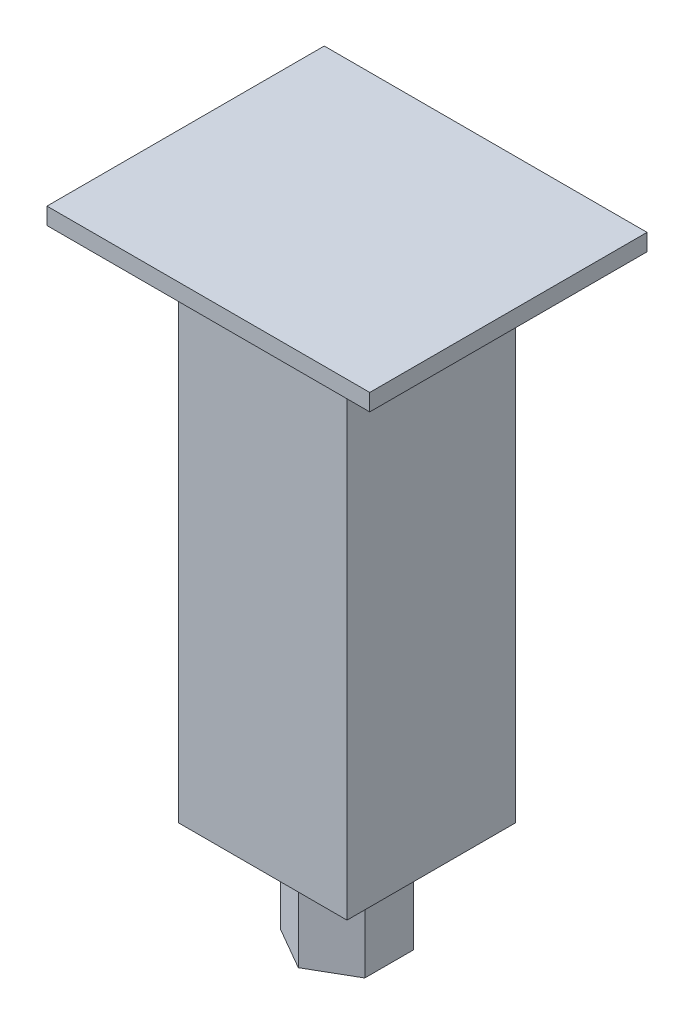
ISO-10303-21;
HEADER;
FILE_DESCRIPTION(('STEP AP214'),'2;1');
FILE_NAME('part.step','',(''),(''),'','','');
FILE_SCHEMA(('AUTOMOTIVE_DESIGN { 1 0 10303 214 1 1 1 1 }'));
ENDSEC;
DATA;
#1=APPLICATION_CONTEXT('core data for automotive mechanical design processes');
#2=APPLICATION_PROTOCOL_DEFINITION('international standard','automotive_design',2000,#1);
#3=PRODUCT_CONTEXT('',#1,'mechanical');
#4=PRODUCT('Part','Part','',(#3));
#5=PRODUCT_RELATED_PRODUCT_CATEGORY('part','',(#4));
#6=PRODUCT_DEFINITION_FORMATION('','',#4);
#7=PRODUCT_DEFINITION_CONTEXT('part definition',#1,'design');
#8=PRODUCT_DEFINITION('design','',#6,#7);
#9=PRODUCT_DEFINITION_SHAPE('','',#8);
#10=(LENGTH_UNIT() NAMED_UNIT(*) SI_UNIT(.MILLI.,.METRE.));
#11=(NAMED_UNIT(*) PLANE_ANGLE_UNIT() SI_UNIT($,.RADIAN.));
#12=(NAMED_UNIT(*) SI_UNIT($,.STERADIAN.) SOLID_ANGLE_UNIT());
#13=UNCERTAINTY_MEASURE_WITH_UNIT(LENGTH_MEASURE(1.E-05),#10,'distance_accuracy_value','');
#14=(GEOMETRIC_REPRESENTATION_CONTEXT(3) GLOBAL_UNCERTAINTY_ASSIGNED_CONTEXT((#13)) GLOBAL_UNIT_ASSIGNED_CONTEXT((#10,
#11,#12)) REPRESENTATION_CONTEXT('',''));
#15=CARTESIAN_POINT('',(0.,0.,0.));
#16=DIRECTION('',(0.,0.,1.));
#17=DIRECTION('',(1.,0.,0.));
#18=AXIS2_PLACEMENT_3D('',#15,#16,#17);
#19=CARTESIAN_POINT('',(5.,12.,-2.88675134594813));
#20=DIRECTION('',(-0.5,0.,0.866025403784439));
#21=DIRECTION('',(0.866025403784439,0.,0.5));
#22=AXIS2_PLACEMENT_3D('',#19,#20,#21);
#23=PLANE('',#22);
#24=DIRECTION('',(-0.866025403784439,0.,-0.5));
#25=VECTOR('',#24,1.);
#26=CARTESIAN_POINT('',(5.,0.,-2.88675134594813));
#27=LINE('',#26,#25);
#28=CARTESIAN_POINT('',(5.,0.,-2.88675134594813));
#29=VERTEX_POINT('',#28);
#30=CARTESIAN_POINT('',(0.,0.,-5.77350269189626));
#31=VERTEX_POINT('',#30);
#32=EDGE_CURVE('E143',#29,#31,#27,.T.);
#33=ORIENTED_EDGE('',*,*,#32,.T.);
#34=DIRECTION('',(0.,-1.,0.));
#35=VECTOR('',#34,1.);
#36=CARTESIAN_POINT('',(0.,12.,-5.77350269189626));
#37=LINE('',#36,#35);
#38=CARTESIAN_POINT('',(0.,12.,-5.77350269189626));
#39=VERTEX_POINT('',#38);
#40=EDGE_CURVE('E11',#39,#31,#37,.T.);
#41=ORIENTED_EDGE('',*,*,#40,.F.);
#42=DIRECTION('',(-0.866025403784439,0.,-0.5));
#43=VECTOR('',#42,1.);
#44=CARTESIAN_POINT('',(5.,12.,-2.88675134594813));
#45=LINE('',#44,#43);
#46=CARTESIAN_POINT('',(5.,12.,-2.88675134594813));
#47=VERTEX_POINT('',#46);
#48=EDGE_CURVE('E133',#47,#39,#45,.T.);
#49=ORIENTED_EDGE('',*,*,#48,.F.);
#50=DIRECTION('',(0.,-1.,0.));
#51=VECTOR('',#50,1.);
#52=CARTESIAN_POINT('',(5.,12.,-2.88675134594813));
#53=LINE('',#52,#51);
#54=EDGE_CURVE('E142',#47,#29,#53,.T.);
#55=ORIENTED_EDGE('',*,*,#54,.T.);
#56=EDGE_LOOP('',(#33,#41,#49,#55));
#57=FACE_BOUND('',#56,.T.);
#58=ADVANCED_FACE('F43',(#57),#23,.F.);
#59=CARTESIAN_POINT('',(0.,12.,-5.77350269189626));
#60=DIRECTION('',(0.5,0.,0.866025403784438));
#61=DIRECTION('',(0.866025403784439,0.,-0.5));
#62=AXIS2_PLACEMENT_3D('',#59,#60,#61);
#63=PLANE('',#62);
#64=DIRECTION('',(-0.866025403784439,0.,0.5));
#65=VECTOR('',#64,1.);
#66=CARTESIAN_POINT('',(0.,0.,-5.77350269189626));
#67=LINE('',#66,#65);
#68=CARTESIAN_POINT('',(-5.,0.,-2.88675134594813));
#69=VERTEX_POINT('',#68);
#70=EDGE_CURVE('E147',#31,#69,#67,.T.);
#71=ORIENTED_EDGE('',*,*,#70,.T.);
#72=DIRECTION('',(0.,-1.,0.));
#73=VECTOR('',#72,1.);
#74=CARTESIAN_POINT('',(-5.,12.,-2.88675134594813));
#75=LINE('',#74,#73);
#76=CARTESIAN_POINT('',(-5.,12.,-2.88675134594813));
#77=VERTEX_POINT('',#76);
#78=EDGE_CURVE('E52',#77,#69,#75,.T.);
#79=ORIENTED_EDGE('',*,*,#78,.F.);
#80=DIRECTION('',(-0.866025403784439,0.,0.5));
#81=VECTOR('',#80,1.);
#82=CARTESIAN_POINT('',(0.,12.,-5.77350269189626));
#83=LINE('',#82,#81);
#84=EDGE_CURVE('E96',#39,#77,#83,.T.);
#85=ORIENTED_EDGE('',*,*,#84,.F.);
#86=ORIENTED_EDGE('',*,*,#40,.T.);
#87=EDGE_LOOP('',(#71,#79,#85,#86));
#88=FACE_BOUND('',#87,.T.);
#89=ADVANCED_FACE('F345',(#88),#63,.F.);
#90=CARTESIAN_POINT('',(-5.,12.,-2.88675134594813));
#91=DIRECTION('',(1.,0.,0.));
#92=DIRECTION('',(0.,0.,-1.));
#93=AXIS2_PLACEMENT_3D('',#90,#91,#92);
#94=PLANE('',#93);
#95=DIRECTION('',(0.,0.,1.));
#96=VECTOR('',#95,1.);
#97=CARTESIAN_POINT('',(-5.,0.,-2.88675134594813));
#98=LINE('',#97,#96);
#99=CARTESIAN_POINT('',(-5.,0.,2.88675134594813));
#100=VERTEX_POINT('',#99);
#101=EDGE_CURVE('E112',#69,#100,#98,.T.);
#102=ORIENTED_EDGE('',*,*,#101,.T.);
#103=DIRECTION('',(0.,-1.,0.));
#104=VECTOR('',#103,1.);
#105=CARTESIAN_POINT('',(-5.,12.,2.88675134594813));
#106=LINE('',#105,#104);
#107=CARTESIAN_POINT('',(-5.,12.,2.88675134594813));
#108=VERTEX_POINT('',#107);
#109=EDGE_CURVE('E105',#108,#100,#106,.T.);
#110=ORIENTED_EDGE('',*,*,#109,.F.);
#111=DIRECTION('',(0.,0.,1.));
#112=VECTOR('',#111,1.);
#113=CARTESIAN_POINT('',(-5.,12.,-2.88675134594813));
#114=LINE('',#113,#112);
#115=EDGE_CURVE('E110',#77,#108,#114,.T.);
#116=ORIENTED_EDGE('',*,*,#115,.F.);
#117=ORIENTED_EDGE('',*,*,#78,.T.);
#118=EDGE_LOOP('',(#102,#110,#116,#117));
#119=FACE_BOUND('',#118,.T.);
#120=ADVANCED_FACE('F107',(#119),#94,.F.);
#121=CARTESIAN_POINT('',(-5.,12.,2.88675134594813));
#122=DIRECTION('',(0.5,0.,-0.866025403784438));
#123=DIRECTION('',(-0.866025403784439,0.,-0.5));
#124=AXIS2_PLACEMENT_3D('',#121,#122,#123);
#125=PLANE('',#124);
#126=DIRECTION('',(0.866025403784439,0.,0.5));
#127=VECTOR('',#126,1.);
#128=CARTESIAN_POINT('',(-5.,0.,2.88675134594813));
#129=LINE('',#128,#127);
#130=CARTESIAN_POINT('',(0.,0.,5.77350269189626));
#131=VERTEX_POINT('',#130);
#132=EDGE_CURVE('E153',#100,#131,#129,.T.);
#133=ORIENTED_EDGE('',*,*,#132,.T.);
#134=DIRECTION('',(0.,-1.,0.));
#135=VECTOR('',#134,1.);
#136=CARTESIAN_POINT('',(0.,12.,5.77350269189626));
#137=LINE('',#136,#135);
#138=CARTESIAN_POINT('',(0.,12.,5.77350269189626));
#139=VERTEX_POINT('',#138);
#140=EDGE_CURVE('E116',#139,#131,#137,.T.);
#141=ORIENTED_EDGE('',*,*,#140,.F.);
#142=DIRECTION('',(0.866025403784439,0.,0.5));
#143=VECTOR('',#142,1.);
#144=CARTESIAN_POINT('',(-5.,12.,2.88675134594813));
#145=LINE('',#144,#143);
#146=EDGE_CURVE('E119',#108,#139,#145,.T.);
#147=ORIENTED_EDGE('',*,*,#146,.F.);
#148=ORIENTED_EDGE('',*,*,#109,.T.);
#149=EDGE_LOOP('',(#133,#141,#147,#148));
#150=FACE_BOUND('',#149,.T.);
#151=ADVANCED_FACE('F120',(#150),#125,.F.);
#152=CARTESIAN_POINT('',(0.,12.,5.77350269189626));
#153=DIRECTION('',(-0.5,0.,-0.866025403784439));
#154=DIRECTION('',(-0.866025403784439,0.,0.5));
#155=AXIS2_PLACEMENT_3D('',#152,#153,#154);
#156=PLANE('',#155);
#157=DIRECTION('',(0.866025403784439,0.,-0.5));
#158=VECTOR('',#157,1.);
#159=CARTESIAN_POINT('',(0.,0.,5.77350269189626));
#160=LINE('',#159,#158);
#161=CARTESIAN_POINT('',(5.,0.,2.88675134594813));
#162=VERTEX_POINT('',#161);
#163=EDGE_CURVE('E82',#131,#162,#160,.T.);
#164=ORIENTED_EDGE('',*,*,#163,.T.);
#165=DIRECTION('',(0.,-1.,0.));
#166=VECTOR('',#165,1.);
#167=CARTESIAN_POINT('',(5.,12.,2.88675134594813));
#168=LINE('',#167,#166);
#169=CARTESIAN_POINT('',(5.,12.,2.88675134594813));
#170=VERTEX_POINT('',#169);
#171=EDGE_CURVE('E60',#170,#162,#168,.T.);
#172=ORIENTED_EDGE('',*,*,#171,.F.);
#173=DIRECTION('',(0.866025403784439,0.,-0.5));
#174=VECTOR('',#173,1.);
#175=CARTESIAN_POINT('',(0.,12.,5.77350269189626));
#176=LINE('',#175,#174);
#177=EDGE_CURVE('E124',#139,#170,#176,.T.);
#178=ORIENTED_EDGE('',*,*,#177,.F.);
#179=ORIENTED_EDGE('',*,*,#140,.T.);
#180=EDGE_LOOP('',(#164,#172,#178,#179));
#181=FACE_BOUND('',#180,.T.);
#182=ADVANCED_FACE('F169',(#181),#156,.F.);
#183=CARTESIAN_POINT('',(5.,12.,2.88675134594813));
#184=DIRECTION('',(-1.,0.,0.));
#185=DIRECTION('',(0.,0.,1.));
#186=AXIS2_PLACEMENT_3D('',#183,#184,#185);
#187=PLANE('',#186);
#188=DIRECTION('',(0.,0.,-1.));
#189=VECTOR('',#188,1.);
#190=CARTESIAN_POINT('',(5.,0.,2.88675134594813));
#191=LINE('',#190,#189);
#192=EDGE_CURVE('E88',#162,#29,#191,.T.);
#193=ORIENTED_EDGE('',*,*,#192,.T.);
#194=ORIENTED_EDGE('',*,*,#54,.F.);
#195=DIRECTION('',(0.,0.,-1.));
#196=VECTOR('',#195,1.);
#197=CARTESIAN_POINT('',(5.,12.,2.88675134594813));
#198=LINE('',#197,#196);
#199=EDGE_CURVE('E139',#170,#47,#198,.T.);
#200=ORIENTED_EDGE('',*,*,#199,.F.);
#201=ORIENTED_EDGE('',*,*,#171,.T.);
#202=EDGE_LOOP('',(#193,#194,#200,#201));
#203=FACE_BOUND('',#202,.T.);
#204=ADVANCED_FACE('F172',(#203),#187,.F.);
#205=CARTESIAN_POINT('',(0.,0.,0.));
#206=DIRECTION('',(0.,1.,0.));
#207=DIRECTION('',(0.,0.,1.));
#208=AXIS2_PLACEMENT_3D('',#205,#206,#207);
#209=PLANE('',#208);
#210=ORIENTED_EDGE('',*,*,#32,.F.);
#211=ORIENTED_EDGE('',*,*,#192,.F.);
#212=ORIENTED_EDGE('',*,*,#163,.F.);
#213=ORIENTED_EDGE('',*,*,#132,.F.);
#214=ORIENTED_EDGE('',*,*,#101,.F.);
#215=ORIENTED_EDGE('',*,*,#70,.F.);
#216=EDGE_LOOP('',(#210,#211,#212,#213,#214,#215));
#217=FACE_BOUND('',#216,.T.);
#218=ADVANCED_FACE('F168',(#217),#209,.F.);
#219=CARTESIAN_POINT('',(10.,72.,10.));
#220=DIRECTION('',(-1.,0.,0.));
#221=DIRECTION('',(0.,0.,1.));
#222=AXIS2_PLACEMENT_3D('',#219,#220,#221);
#223=PLANE('',#222);
#224=DIRECTION('',(0.,0.,-1.));
#225=VECTOR('',#224,1.);
#226=CARTESIAN_POINT('',(10.,12.,10.));
#227=LINE('',#226,#225);
#228=CARTESIAN_POINT('',(10.,12.,10.));
#229=VERTEX_POINT('',#228);
#230=CARTESIAN_POINT('',(10.,12.,-10.));
#231=VERTEX_POINT('',#230);
#232=EDGE_CURVE('E205',#229,#231,#227,.T.);
#233=ORIENTED_EDGE('',*,*,#232,.T.);
#234=DIRECTION('',(0.,-1.,0.));
#235=VECTOR('',#234,1.);
#236=CARTESIAN_POINT('',(10.,72.,-10.));
#237=LINE('',#236,#235);
#238=CARTESIAN_POINT('',(10.,72.,-10.));
#239=VERTEX_POINT('',#238);
#240=EDGE_CURVE('E148',#239,#231,#237,.T.);
#241=ORIENTED_EDGE('',*,*,#240,.F.);
#242=DIRECTION('',(0.,0.,-1.));
#243=VECTOR('',#242,1.);
#244=CARTESIAN_POINT('',(10.,72.,10.));
#245=LINE('',#244,#243);
#246=CARTESIAN_POINT('',(10.,72.,10.));
#247=VERTEX_POINT('',#246);
#248=EDGE_CURVE('E196',#247,#239,#245,.T.);
#249=ORIENTED_EDGE('',*,*,#248,.F.);
#250=DIRECTION('',(0.,-1.,0.));
#251=VECTOR('',#250,1.);
#252=CARTESIAN_POINT('',(10.,72.,10.));
#253=LINE('',#252,#251);
#254=EDGE_CURVE('E187',#247,#229,#253,.T.);
#255=ORIENTED_EDGE('',*,*,#254,.T.);
#256=EDGE_LOOP('',(#233,#241,#249,#255));
#257=FACE_BOUND('',#256,.T.);
#258=ADVANCED_FACE('F327',(#257),#223,.F.);
#259=CARTESIAN_POINT('',(-10.,72.,-10.));
#260=DIRECTION('',(0.,0.,1.));
#261=DIRECTION('',(1.,0.,0.));
#262=AXIS2_PLACEMENT_3D('',#259,#260,#261);
#263=PLANE('',#262);
#264=DIRECTION('',(-1.,0.,0.));
#265=VECTOR('',#264,1.);
#266=CARTESIAN_POINT('',(-10.,12.,-10.));
#267=LINE('',#266,#265);
#268=CARTESIAN_POINT('',(-10.,12.,-10.));
#269=VERTEX_POINT('',#268);
#270=EDGE_CURVE('E201',#231,#269,#267,.T.);
#271=ORIENTED_EDGE('',*,*,#270,.T.);
#272=DIRECTION('',(0.,-1.,0.));
#273=VECTOR('',#272,1.);
#274=CARTESIAN_POINT('',(-10.,72.,-10.));
#275=LINE('',#274,#273);
#276=CARTESIAN_POINT('',(-10.,72.,-10.));
#277=VERTEX_POINT('',#276);
#278=EDGE_CURVE('E179',#277,#269,#275,.T.);
#279=ORIENTED_EDGE('',*,*,#278,.F.);
#280=DIRECTION('',(-1.,0.,0.));
#281=VECTOR('',#280,1.);
#282=CARTESIAN_POINT('',(-10.,72.,-10.));
#283=LINE('',#282,#281);
#284=EDGE_CURVE('E217',#239,#277,#283,.T.);
#285=ORIENTED_EDGE('',*,*,#284,.F.);
#286=ORIENTED_EDGE('',*,*,#240,.T.);
#287=EDGE_LOOP('',(#271,#279,#285,#286));
#288=FACE_BOUND('',#287,.T.);
#289=ADVANCED_FACE('F330',(#288),#263,.F.);
#290=CARTESIAN_POINT('',(-10.,72.,10.));
#291=DIRECTION('',(1.,0.,0.));
#292=DIRECTION('',(0.,0.,-1.));
#293=AXIS2_PLACEMENT_3D('',#290,#291,#292);
#294=PLANE('',#293);
#295=DIRECTION('',(0.,0.,1.));
#296=VECTOR('',#295,1.);
#297=CARTESIAN_POINT('',(-10.,12.,10.));
#298=LINE('',#297,#296);
#299=CARTESIAN_POINT('',(-10.,12.,10.));
#300=VERTEX_POINT('',#299);
#301=EDGE_CURVE('E197',#269,#300,#298,.T.);
#302=ORIENTED_EDGE('',*,*,#301,.T.);
#303=DIRECTION('',(0.,-1.,0.));
#304=VECTOR('',#303,1.);
#305=CARTESIAN_POINT('',(-10.,72.,10.));
#306=LINE('',#305,#304);
#307=CARTESIAN_POINT('',(-10.,72.,10.));
#308=VERTEX_POINT('',#307);
#309=EDGE_CURVE('E183',#308,#300,#306,.T.);
#310=ORIENTED_EDGE('',*,*,#309,.F.);
#311=DIRECTION('',(0.,0.,1.));
#312=VECTOR('',#311,1.);
#313=CARTESIAN_POINT('',(-10.,72.,10.));
#314=LINE('',#313,#312);
#315=EDGE_CURVE('E213',#277,#308,#314,.T.);
#316=ORIENTED_EDGE('',*,*,#315,.F.);
#317=ORIENTED_EDGE('',*,*,#278,.T.);
#318=EDGE_LOOP('',(#302,#310,#316,#317));
#319=FACE_BOUND('',#318,.T.);
#320=ADVANCED_FACE('F335',(#319),#294,.F.);
#321=CARTESIAN_POINT('',(-10.,72.,10.));
#322=DIRECTION('',(0.,0.,-1.));
#323=DIRECTION('',(-1.,0.,0.));
#324=AXIS2_PLACEMENT_3D('',#321,#322,#323);
#325=PLANE('',#324);
#326=DIRECTION('',(1.,0.,0.));
#327=VECTOR('',#326,1.);
#328=CARTESIAN_POINT('',(-10.,12.,10.));
#329=LINE('',#328,#327);
#330=EDGE_CURVE('E192',#300,#229,#329,.T.);
#331=ORIENTED_EDGE('',*,*,#330,.T.);
#332=ORIENTED_EDGE('',*,*,#254,.F.);
#333=DIRECTION('',(1.,0.,0.));
#334=VECTOR('',#333,1.);
#335=CARTESIAN_POINT('',(-10.,72.,10.));
#336=LINE('',#335,#334);
#337=EDGE_CURVE('E191',#308,#247,#336,.T.);
#338=ORIENTED_EDGE('',*,*,#337,.F.);
#339=ORIENTED_EDGE('',*,*,#309,.T.);
#340=EDGE_LOOP('',(#331,#332,#338,#339));
#341=FACE_BOUND('',#340,.T.);
#342=ADVANCED_FACE('F322',(#341),#325,.F.);
#343=CARTESIAN_POINT('',(0.,12.,0.));
#344=DIRECTION('',(0.,-1.,0.));
#345=DIRECTION('',(0.,0.,-1.));
#346=AXIS2_PLACEMENT_3D('',#343,#344,#345);
#347=PLANE('',#346);
#348=ORIENTED_EDGE('',*,*,#199,.T.);
#349=ORIENTED_EDGE('',*,*,#48,.T.);
#350=ORIENTED_EDGE('',*,*,#84,.T.);
#351=ORIENTED_EDGE('',*,*,#115,.T.);
#352=ORIENTED_EDGE('',*,*,#146,.T.);
#353=ORIENTED_EDGE('',*,*,#177,.T.);
#354=EDGE_LOOP('',(#348,#349,#350,#351,#352,#353));
#355=FACE_BOUND('',#354,.T.);
#356=ORIENTED_EDGE('',*,*,#232,.F.);
#357=ORIENTED_EDGE('',*,*,#330,.F.);
#358=ORIENTED_EDGE('',*,*,#301,.F.);
#359=ORIENTED_EDGE('',*,*,#270,.F.);
#360=EDGE_LOOP('',(#356,#357,#358,#359));
#361=FACE_BOUND('',#360,.T.);
#362=ADVANCED_FACE('F127',(#355,#361),#347,.T.);
#363=CARTESIAN_POINT('',(19.1421160610985,74.,16.4444272113751));
#364=DIRECTION('',(-1.,0.,0.));
#365=DIRECTION('',(0.,0.,1.));
#366=AXIS2_PLACEMENT_3D('',#363,#364,#365);
#367=PLANE('',#366);
#368=DIRECTION('',(0.,0.,-1.));
#369=VECTOR('',#368,1.);
#370=CARTESIAN_POINT('',(19.1421160610985,72.,16.4444272113751));
#371=LINE('',#370,#369);
#372=CARTESIAN_POINT('',(19.1421160610985,72.,16.4444272113751));
#373=VERTEX_POINT('',#372);
#374=CARTESIAN_POINT('',(19.1421160610985,72.,-16.4444272113751));
#375=VERTEX_POINT('',#374);
#376=EDGE_CURVE('E253',#373,#375,#371,.T.);
#377=ORIENTED_EDGE('',*,*,#376,.T.);
#378=DIRECTION('',(0.,-1.,0.));
#379=VECTOR('',#378,1.);
#380=CARTESIAN_POINT('',(19.1421160610985,74.,-16.4444272113751));
#381=LINE('',#380,#379);
#382=CARTESIAN_POINT('',(19.1421160610985,74.,-16.4444272113751));
#383=VERTEX_POINT('',#382);
#384=EDGE_CURVE('E209',#383,#375,#381,.T.);
#385=ORIENTED_EDGE('',*,*,#384,.F.);
#386=DIRECTION('',(0.,0.,-1.));
#387=VECTOR('',#386,1.);
#388=CARTESIAN_POINT('',(19.1421160610985,74.,16.4444272113751));
#389=LINE('',#388,#387);
#390=CARTESIAN_POINT('',(19.1421160610985,74.,16.4444272113751));
#391=VERTEX_POINT('',#390);
#392=EDGE_CURVE('E244',#391,#383,#389,.T.);
#393=ORIENTED_EDGE('',*,*,#392,.F.);
#394=DIRECTION('',(0.,-1.,0.));
#395=VECTOR('',#394,1.);
#396=CARTESIAN_POINT('',(19.1421160610985,74.,16.4444272113751));
#397=LINE('',#396,#395);
#398=EDGE_CURVE('E235',#391,#373,#397,.T.);
#399=ORIENTED_EDGE('',*,*,#398,.T.);
#400=EDGE_LOOP('',(#377,#385,#393,#399));
#401=FACE_BOUND('',#400,.T.);
#402=ADVANCED_FACE('F284',(#401),#367,.F.);
#403=CARTESIAN_POINT('',(-19.1421160610985,74.,-16.4444272113751));
#404=DIRECTION('',(0.,0.,1.));
#405=DIRECTION('',(1.,0.,0.));
#406=AXIS2_PLACEMENT_3D('',#403,#404,#405);
#407=PLANE('',#406);
#408=DIRECTION('',(-1.,0.,0.));
#409=VECTOR('',#408,1.);
#410=CARTESIAN_POINT('',(-19.1421160610985,72.,-16.4444272113751));
#411=LINE('',#410,#409);
#412=CARTESIAN_POINT('',(-19.1421160610985,72.,-16.4444272113751));
#413=VERTEX_POINT('',#412);
#414=EDGE_CURVE('E249',#375,#413,#411,.T.);
#415=ORIENTED_EDGE('',*,*,#414,.T.);
#416=DIRECTION('',(0.,-1.,0.));
#417=VECTOR('',#416,1.);
#418=CARTESIAN_POINT('',(-19.1421160610985,74.,-16.4444272113751));
#419=LINE('',#418,#417);
#420=CARTESIAN_POINT('',(-19.1421160610985,74.,-16.4444272113751));
#421=VERTEX_POINT('',#420);
#422=EDGE_CURVE('E227',#421,#413,#419,.T.);
#423=ORIENTED_EDGE('',*,*,#422,.F.);
#424=DIRECTION('',(-1.,0.,0.));
#425=VECTOR('',#424,1.);
#426=CARTESIAN_POINT('',(-19.1421160610985,74.,-16.4444272113751));
#427=LINE('',#426,#425);
#428=EDGE_CURVE('E264',#383,#421,#427,.T.);
#429=ORIENTED_EDGE('',*,*,#428,.F.);
#430=ORIENTED_EDGE('',*,*,#384,.T.);
#431=EDGE_LOOP('',(#415,#423,#429,#430));
#432=FACE_BOUND('',#431,.T.);
#433=ADVANCED_FACE('F288',(#432),#407,.F.);
#434=CARTESIAN_POINT('',(-19.1421160610985,74.,16.4444272113751));
#435=DIRECTION('',(1.,0.,0.));
#436=DIRECTION('',(0.,0.,-1.));
#437=AXIS2_PLACEMENT_3D('',#434,#435,#436);
#438=PLANE('',#437);
#439=DIRECTION('',(0.,0.,1.));
#440=VECTOR('',#439,1.);
#441=CARTESIAN_POINT('',(-19.1421160610985,72.,16.4444272113751));
#442=LINE('',#441,#440);
#443=CARTESIAN_POINT('',(-19.1421160610985,72.,16.4444272113751));
#444=VERTEX_POINT('',#443);
#445=EDGE_CURVE('E245',#413,#444,#442,.T.);
#446=ORIENTED_EDGE('',*,*,#445,.T.);
#447=DIRECTION('',(0.,-1.,0.));
#448=VECTOR('',#447,1.);
#449=CARTESIAN_POINT('',(-19.1421160610985,74.,16.4444272113751));
#450=LINE('',#449,#448);
#451=CARTESIAN_POINT('',(-19.1421160610985,74.,16.4444272113751));
#452=VERTEX_POINT('',#451);
#453=EDGE_CURVE('E231',#452,#444,#450,.T.);
#454=ORIENTED_EDGE('',*,*,#453,.F.);
#455=DIRECTION('',(0.,0.,1.));
#456=VECTOR('',#455,1.);
#457=CARTESIAN_POINT('',(-19.1421160610985,74.,16.4444272113751));
#458=LINE('',#457,#456);
#459=EDGE_CURVE('E260',#421,#452,#458,.T.);
#460=ORIENTED_EDGE('',*,*,#459,.F.);
#461=ORIENTED_EDGE('',*,*,#422,.T.);
#462=EDGE_LOOP('',(#446,#454,#460,#461));
#463=FACE_BOUND('',#462,.T.);
#464=ADVANCED_FACE('F403',(#463),#438,.F.);
#465=CARTESIAN_POINT('',(-19.1421160610985,74.,16.4444272113751));
#466=DIRECTION('',(0.,0.,-1.));
#467=DIRECTION('',(-1.,0.,0.));
#468=AXIS2_PLACEMENT_3D('',#465,#466,#467);
#469=PLANE('',#468);
#470=DIRECTION('',(1.,0.,0.));
#471=VECTOR('',#470,1.);
#472=CARTESIAN_POINT('',(-19.1421160610985,72.,16.4444272113751));
#473=LINE('',#472,#471);
#474=EDGE_CURVE('E240',#444,#373,#473,.T.);
#475=ORIENTED_EDGE('',*,*,#474,.T.);
#476=ORIENTED_EDGE('',*,*,#398,.F.);
#477=DIRECTION('',(1.,0.,0.));
#478=VECTOR('',#477,1.);
#479=CARTESIAN_POINT('',(-19.1421160610985,74.,16.4444272113751));
#480=LINE('',#479,#478);
#481=EDGE_CURVE('E239',#452,#391,#480,.T.);
#482=ORIENTED_EDGE('',*,*,#481,.F.);
#483=ORIENTED_EDGE('',*,*,#453,.T.);
#484=EDGE_LOOP('',(#475,#476,#482,#483));
#485=FACE_BOUND('',#484,.T.);
#486=ADVANCED_FACE('F410',(#485),#469,.F.);
#487=CARTESIAN_POINT('',(0.,74.,0.));
#488=DIRECTION('',(0.,-1.,0.));
#489=DIRECTION('',(0.,0.,-1.));
#490=AXIS2_PLACEMENT_3D('',#487,#488,#489);
#491=PLANE('',#490);
#492=ORIENTED_EDGE('',*,*,#392,.T.);
#493=ORIENTED_EDGE('',*,*,#428,.T.);
#494=ORIENTED_EDGE('',*,*,#459,.T.);
#495=ORIENTED_EDGE('',*,*,#481,.T.);
#496=EDGE_LOOP('',(#492,#493,#494,#495));
#497=FACE_BOUND('',#496,.T.);
#498=ADVANCED_FACE('F274',(#497),#491,.F.);
#499=CARTESIAN_POINT('',(0.,72.,0.));
#500=DIRECTION('',(0.,-1.,0.));
#501=DIRECTION('',(0.,0.,-1.));
#502=AXIS2_PLACEMENT_3D('',#499,#500,#501);
#503=PLANE('',#502);
#504=ORIENTED_EDGE('',*,*,#337,.T.);
#505=ORIENTED_EDGE('',*,*,#248,.T.);
#506=ORIENTED_EDGE('',*,*,#284,.T.);
#507=ORIENTED_EDGE('',*,*,#315,.T.);
#508=EDGE_LOOP('',(#504,#505,#506,#507));
#509=FACE_BOUND('',#508,.T.);
#510=ORIENTED_EDGE('',*,*,#376,.F.);
#511=ORIENTED_EDGE('',*,*,#474,.F.);
#512=ORIENTED_EDGE('',*,*,#445,.F.);
#513=ORIENTED_EDGE('',*,*,#414,.F.);
#514=EDGE_LOOP('',(#510,#511,#512,#513));
#515=FACE_BOUND('',#514,.T.);
#516=ADVANCED_FACE('F332',(#509,#515),#503,.T.);
#517=CLOSED_SHELL('',(#58,#89,#120,#151,#182,#204,#218,#258,#289,#320,#342,#362,#402,#433,#464,
#486,#498,#516));
#518=MANIFOLD_SOLID_BREP('B2',#517);
#519=ADVANCED_BREP_SHAPE_REPRESENTATION('',(#18,#518),#14);
#520=SHAPE_DEFINITION_REPRESENTATION(#9,#519);
ENDSEC;
END-ISO-10303-21;
